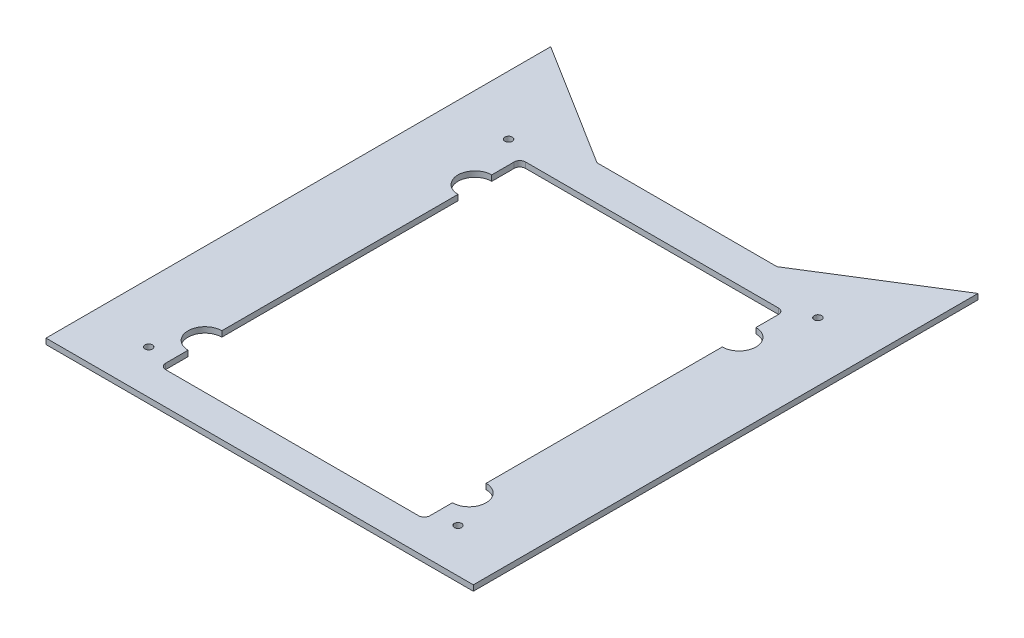
ISO-10303-21;
HEADER;
FILE_DESCRIPTION(('STEP AP214'),'2;1');
FILE_NAME('part.step','',(''),(''),'','','');
FILE_SCHEMA(('AUTOMOTIVE_DESIGN { 1 0 10303 214 1 1 1 1 }'));
ENDSEC;
DATA;
#1=APPLICATION_CONTEXT('core data for automotive mechanical design processes');
#2=APPLICATION_PROTOCOL_DEFINITION('international standard','automotive_design',2000,#1);
#3=PRODUCT_CONTEXT('',#1,'mechanical');
#4=PRODUCT('Part','Part','',(#3));
#5=PRODUCT_RELATED_PRODUCT_CATEGORY('part','',(#4));
#6=PRODUCT_DEFINITION_FORMATION('','',#4);
#7=PRODUCT_DEFINITION_CONTEXT('part definition',#1,'design');
#8=PRODUCT_DEFINITION('design','',#6,#7);
#9=PRODUCT_DEFINITION_SHAPE('','',#8);
#10=(LENGTH_UNIT() NAMED_UNIT(*) SI_UNIT(.MILLI.,.METRE.));
#11=(NAMED_UNIT(*) PLANE_ANGLE_UNIT() SI_UNIT($,.RADIAN.));
#12=(NAMED_UNIT(*) SI_UNIT($,.STERADIAN.) SOLID_ANGLE_UNIT());
#13=UNCERTAINTY_MEASURE_WITH_UNIT(LENGTH_MEASURE(1.E-05),#10,'distance_accuracy_value','');
#14=(GEOMETRIC_REPRESENTATION_CONTEXT(3) GLOBAL_UNCERTAINTY_ASSIGNED_CONTEXT((#13)) GLOBAL_UNIT_ASSIGNED_CONTEXT((#10,
#11,#12)) REPRESENTATION_CONTEXT('',''));
#15=CARTESIAN_POINT('',(0.,0.,0.));
#16=DIRECTION('',(0.,0.,1.));
#17=DIRECTION('',(1.,0.,0.));
#18=AXIS2_PLACEMENT_3D('',#15,#16,#17);
#19=CARTESIAN_POINT('',(0.,3.175,0.));
#20=DIRECTION('',(0.,1.,0.));
#21=DIRECTION('',(0.,0.,1.));
#22=AXIS2_PLACEMENT_3D('',#19,#20,#21);
#23=PLANE('',#22);
#24=DIRECTION('',(0.,0.,-1.));
#25=VECTOR('',#24,1.);
#26=CARTESIAN_POINT('',(-96.6368353735841,3.175,153.2154013619));
#27=LINE('',#26,#25);
#28=CARTESIAN_POINT('',(-96.6368353735841,3.175,438.1716513619));
#29=VERTEX_POINT('',#28);
#30=CARTESIAN_POINT('',(-96.6368353735841,3.175,153.2154013619));
#31=VERTEX_POINT('',#30);
#32=EDGE_CURVE('E66',#29,#31,#27,.T.);
#33=ORIENTED_EDGE('',*,*,#32,.F.);
#34=DIRECTION('',(1.,0.,0.));
#35=VECTOR('',#34,1.);
#36=CARTESIAN_POINT('',(-191.886835373584,3.175,438.1716513619));
#37=LINE('',#36,#35);
#38=CARTESIAN_POINT('',(144.663164626416,3.175,438.171651361899));
#39=VERTEX_POINT('',#38);
#40=EDGE_CURVE('E215',#29,#39,#37,.T.);
#41=ORIENTED_EDGE('',*,*,#40,.T.);
#42=DIRECTION('',(0.,0.,1.));
#43=VECTOR('',#42,1.);
#44=CARTESIAN_POINT('',(144.663164626416,3.175,153.2154013619));
#45=LINE('',#44,#43);
#46=CARTESIAN_POINT('',(144.663164626416,3.175,153.2154013619));
#47=VERTEX_POINT('',#46);
#48=EDGE_CURVE('E381',#47,#39,#45,.T.);
#49=ORIENTED_EDGE('',*,*,#48,.F.);
#50=DIRECTION('',(-0.847998304005083,0.,0.529998940003187));
#51=VECTOR('',#50,1.);
#52=CARTESIAN_POINT('',(176.413164626416,3.175,133.371651361899));
#53=LINE('',#52,#51);
#54=CARTESIAN_POINT('',(74.8131646264159,3.175,196.871651361901));
#55=VERTEX_POINT('',#54);
#56=EDGE_CURVE('E221',#47,#55,#53,.T.);
#57=ORIENTED_EDGE('',*,*,#56,.T.);
#58=DIRECTION('',(-1.,0.,0.));
#59=VECTOR('',#58,1.);
#60=CARTESIAN_POINT('',(74.8131646264159,3.175,196.871651361901));
#61=LINE('',#60,#59);
#62=CARTESIAN_POINT('',(-26.7868353735841,3.175,196.871651361901));
#63=VERTEX_POINT('',#62);
#64=EDGE_CURVE('E518',#55,#63,#61,.T.);
#65=ORIENTED_EDGE('',*,*,#64,.T.);
#66=DIRECTION('',(-0.847998304005083,0.,-0.529998940003187));
#67=VECTOR('',#66,1.);
#68=CARTESIAN_POINT('',(-128.386835373584,3.175,133.371651361899));
#69=LINE('',#68,#67);
#70=EDGE_CURVE('E230',#63,#31,#69,.T.);
#71=ORIENTED_EDGE('',*,*,#70,.T.);
#72=EDGE_LOOP('',(#33,#41,#49,#57,#65,#71));
#73=FACE_BOUND('',#72,.T.);
#74=CARTESIAN_POINT('',(111.32566462639,3.175,413.498576853187));
#75=DIRECTION('',(0.,1.,0.));
#76=DIRECTION('',(0.,0.,1.));
#77=AXIS2_PLACEMENT_3D('',#74,#75,#76);
#78=CIRCLE('',#77,2.08280000000002);
#79=CARTESIAN_POINT('',(111.32566462639,3.175,415.581376853187));
#80=VERTEX_POINT('',#79);
#81=EDGE_CURVE('E364',#80,#80,#78,.T.);
#82=ORIENTED_EDGE('',*,*,#81,.F.);
#83=EDGE_LOOP('',(#82));
#84=FACE_BOUND('',#83,.T.);
#85=CARTESIAN_POINT('',(-63.2993353736587,3.175,413.498576853187));
#86=DIRECTION('',(0.,1.,0.));
#87=DIRECTION('',(0.,0.,-1.));
#88=AXIS2_PLACEMENT_3D('',#85,#86,#87);
#89=CIRCLE('',#88,2.0828);
#90=CARTESIAN_POINT('',(-63.2993353736587,3.175,411.415776853187));
#91=VERTEX_POINT('',#90);
#92=EDGE_CURVE('E500',#91,#91,#89,.T.);
#93=ORIENTED_EDGE('',*,*,#92,.F.);
#94=EDGE_LOOP('',(#93));
#95=FACE_BOUND('',#94,.T.);
#96=CARTESIAN_POINT('',(-63.2993353736587,3.175,210.298576853187));
#97=DIRECTION('',(0.,1.,0.));
#98=DIRECTION('',(0.,0.,-1.));
#99=AXIS2_PLACEMENT_3D('',#96,#97,#98);
#100=CIRCLE('',#99,2.0828);
#101=CARTESIAN_POINT('',(-63.2993353736587,3.175,208.215776853187));
#102=VERTEX_POINT('',#101);
#103=EDGE_CURVE('E393',#102,#102,#100,.T.);
#104=ORIENTED_EDGE('',*,*,#103,.F.);
#105=EDGE_LOOP('',(#104));
#106=FACE_BOUND('',#105,.T.);
#107=CARTESIAN_POINT('',(98.6256646263904,3.175,394.448576853187));
#108=DIRECTION('',(0.,1.,0.));
#109=DIRECTION('',(0.,0.,1.));
#110=AXIS2_PLACEMENT_3D('',#107,#108,#109);
#111=CIRCLE('',#110,9.52500000000001);
#112=CARTESIAN_POINT('',(98.6256646263904,3.175,403.973576853187));
#113=VERTEX_POINT('',#112);
#114=CARTESIAN_POINT('',(98.6256646263904,3.175,384.923576853187));
#115=VERTEX_POINT('',#114);
#116=EDGE_CURVE('E410',#113,#115,#111,.T.);
#117=ORIENTED_EDGE('',*,*,#116,.F.);
#118=DIRECTION('',(0.,0.,-1.));
#119=VECTOR('',#118,1.);
#120=CARTESIAN_POINT('',(98.6256646263904,3.175,403.973576853187));
#121=LINE('',#120,#119);
#122=CARTESIAN_POINT('',(98.6256646263904,3.175,416.673576853187));
#123=VERTEX_POINT('',#122);
#124=EDGE_CURVE('E413',#123,#113,#121,.T.);
#125=ORIENTED_EDGE('',*,*,#124,.F.);
#126=CARTESIAN_POINT('',(95.4506646263903,3.175,416.673576853187));
#127=DIRECTION('',(0.,1.,0.));
#128=DIRECTION('',(0.,0.,1.));
#129=AXIS2_PLACEMENT_3D('',#126,#127,#128);
#130=CIRCLE('',#129,3.175);
#131=CARTESIAN_POINT('',(95.4506646263903,3.175,419.848576853187));
#132=VERTEX_POINT('',#131);
#133=EDGE_CURVE('E271',#123,#132,#130,.F.);
#134=ORIENTED_EDGE('',*,*,#133,.T.);
#135=DIRECTION('',(1.,0.,0.));
#136=VECTOR('',#135,1.);
#137=CARTESIAN_POINT('',(-50.5993353736097,3.175,419.848576853187));
#138=LINE('',#137,#136);
#139=CARTESIAN_POINT('',(-47.4243353736097,3.175,419.848576853187));
#140=VERTEX_POINT('',#139);
#141=EDGE_CURVE('E422',#140,#132,#138,.T.);
#142=ORIENTED_EDGE('',*,*,#141,.F.);
#143=CARTESIAN_POINT('',(-47.4243353736097,3.175,416.673576853187));
#144=DIRECTION('',(0.,1.,0.));
#145=DIRECTION('',(0.,0.,1.));
#146=AXIS2_PLACEMENT_3D('',#143,#144,#145);
#147=CIRCLE('',#146,3.175);
#148=CARTESIAN_POINT('',(-50.5993353736097,3.175,416.673576853187));
#149=VERTEX_POINT('',#148);
#150=EDGE_CURVE('E265',#140,#149,#147,.F.);
#151=ORIENTED_EDGE('',*,*,#150,.T.);
#152=DIRECTION('',(0.,0.,1.));
#153=VECTOR('',#152,1.);
#154=CARTESIAN_POINT('',(-50.5993353736097,3.175,403.973576853187));
#155=LINE('',#154,#153);
#156=CARTESIAN_POINT('',(-50.5993353736097,3.175,403.973576853187));
#157=VERTEX_POINT('',#156);
#158=EDGE_CURVE('E428',#157,#149,#155,.T.);
#159=ORIENTED_EDGE('',*,*,#158,.F.);
#160=CARTESIAN_POINT('',(-50.5993353736097,3.175,394.448576853187));
#161=DIRECTION('',(0.,1.,0.));
#162=DIRECTION('',(0.,0.,1.));
#163=AXIS2_PLACEMENT_3D('',#160,#161,#162);
#164=CIRCLE('',#163,9.52500000000001);
#165=CARTESIAN_POINT('',(-50.5993353736097,3.175,384.923576853187));
#166=VERTEX_POINT('',#165);
#167=EDGE_CURVE('E438',#166,#157,#164,.T.);
#168=ORIENTED_EDGE('',*,*,#167,.F.);
#169=DIRECTION('',(0.,0.,1.));
#170=VECTOR('',#169,1.);
#171=CARTESIAN_POINT('',(-50.5993353736097,3.175,251.573576853187));
#172=LINE('',#171,#170);
#173=CARTESIAN_POINT('',(-50.5993353736097,3.175,251.573576853187));
#174=VERTEX_POINT('',#173);
#175=EDGE_CURVE('E441',#174,#166,#172,.T.);
#176=ORIENTED_EDGE('',*,*,#175,.F.);
#177=CARTESIAN_POINT('',(-50.5993353736097,3.175,242.048576853187));
#178=DIRECTION('',(0.,1.,0.));
#179=DIRECTION('',(0.,0.,1.));
#180=AXIS2_PLACEMENT_3D('',#177,#178,#179);
#181=CIRCLE('',#180,9.52500000000001);
#182=CARTESIAN_POINT('',(-50.5993353736097,3.175,232.523576853187));
#183=VERTEX_POINT('',#182);
#184=EDGE_CURVE('E320',#183,#174,#181,.T.);
#185=ORIENTED_EDGE('',*,*,#184,.F.);
#186=DIRECTION('',(0.,0.,1.));
#187=VECTOR('',#186,1.);
#188=CARTESIAN_POINT('',(-50.5993353736097,3.175,216.648576853187));
#189=LINE('',#188,#187);
#190=CARTESIAN_POINT('',(-50.5993353736097,3.175,219.823576853187));
#191=VERTEX_POINT('',#190);
#192=EDGE_CURVE('E311',#191,#183,#189,.T.);
#193=ORIENTED_EDGE('',*,*,#192,.F.);
#194=CARTESIAN_POINT('',(-47.4243353736097,3.175,219.823576853187));
#195=DIRECTION('',(0.,1.,0.));
#196=DIRECTION('',(0.,0.,1.));
#197=AXIS2_PLACEMENT_3D('',#194,#195,#196);
#198=CIRCLE('',#197,3.175);
#199=CARTESIAN_POINT('',(-47.4243353736097,3.175,216.648576853187));
#200=VERTEX_POINT('',#199);
#201=EDGE_CURVE('E12',#191,#200,#198,.F.);
#202=ORIENTED_EDGE('',*,*,#201,.T.);
#203=DIRECTION('',(-1.,0.,0.));
#204=VECTOR('',#203,1.);
#205=CARTESIAN_POINT('',(-50.5993353736097,3.175,216.648576853187));
#206=LINE('',#205,#204);
#207=CARTESIAN_POINT('',(95.4506646263903,3.175,216.648576853187));
#208=VERTEX_POINT('',#207);
#209=EDGE_CURVE('E308',#208,#200,#206,.T.);
#210=ORIENTED_EDGE('',*,*,#209,.F.);
#211=CARTESIAN_POINT('',(95.4506646263903,3.175,219.823576853187));
#212=DIRECTION('',(0.,1.,0.));
#213=DIRECTION('',(0.,0.,1.));
#214=AXIS2_PLACEMENT_3D('',#211,#212,#213);
#215=CIRCLE('',#214,3.175);
#216=CARTESIAN_POINT('',(98.6256646263903,3.175,219.823576853187));
#217=VERTEX_POINT('',#216);
#218=EDGE_CURVE('E277',#208,#217,#215,.F.);
#219=ORIENTED_EDGE('',*,*,#218,.T.);
#220=DIRECTION('',(0.,0.,-1.));
#221=VECTOR('',#220,1.);
#222=CARTESIAN_POINT('',(98.6256646263903,3.175,216.648576853187));
#223=LINE('',#222,#221);
#224=CARTESIAN_POINT('',(98.6256646263903,3.175,232.523576853187));
#225=VERTEX_POINT('',#224);
#226=EDGE_CURVE('E316',#225,#217,#223,.T.);
#227=ORIENTED_EDGE('',*,*,#226,.F.);
#228=CARTESIAN_POINT('',(98.6256646263903,3.175,242.048576853187));
#229=DIRECTION('',(0.,1.,0.));
#230=DIRECTION('',(0.,0.,1.));
#231=AXIS2_PLACEMENT_3D('',#228,#229,#230);
#232=CIRCLE('',#231,9.52500000000001);
#233=CARTESIAN_POINT('',(98.6256646263903,3.175,251.573576853187));
#234=VERTEX_POINT('',#233);
#235=EDGE_CURVE('E323',#234,#225,#232,.T.);
#236=ORIENTED_EDGE('',*,*,#235,.F.);
#237=DIRECTION('',(0.,0.,-1.));
#238=VECTOR('',#237,1.);
#239=CARTESIAN_POINT('',(98.6256646263903,3.175,251.573576853187));
#240=LINE('',#239,#238);
#241=EDGE_CURVE('E342',#115,#234,#240,.T.);
#242=ORIENTED_EDGE('',*,*,#241,.F.);
#243=EDGE_LOOP('',(#117,#125,#134,#142,#151,#159,#168,#176,#185,#193,#202,#210,#219,#227,#236,#242));
#244=FACE_BOUND('',#243,.T.);
#245=CARTESIAN_POINT('',(111.32566462639,3.175,210.298576853187));
#246=DIRECTION('',(0.,1.,0.));
#247=DIRECTION('',(0.,0.,1.));
#248=AXIS2_PLACEMENT_3D('',#245,#246,#247);
#249=CIRCLE('',#248,2.0828);
#250=CARTESIAN_POINT('',(111.32566462639,3.175,212.381376853187));
#251=VERTEX_POINT('',#250);
#252=EDGE_CURVE('E352',#251,#251,#249,.T.);
#253=ORIENTED_EDGE('',*,*,#252,.F.);
#254=EDGE_LOOP('',(#253));
#255=FACE_BOUND('',#254,.T.);
#256=ADVANCED_FACE('F42',(#73,#84,#95,#106,#244,#255),#23,.T.);
#257=CARTESIAN_POINT('',(0.,0.,0.));
#258=DIRECTION('',(0.,1.,0.));
#259=DIRECTION('',(0.,0.,1.));
#260=AXIS2_PLACEMENT_3D('',#257,#258,#259);
#261=PLANE('',#260);
#262=CARTESIAN_POINT('',(111.32566462639,0.,413.498576853187));
#263=DIRECTION('',(0.,1.,0.));
#264=DIRECTION('',(0.,0.,1.));
#265=AXIS2_PLACEMENT_3D('',#262,#263,#264);
#266=CIRCLE('',#265,2.08280000000002);
#267=CARTESIAN_POINT('',(111.32566462639,0.,415.581376853187));
#268=VERTEX_POINT('',#267);
#269=EDGE_CURVE('E503',#268,#268,#266,.T.);
#270=ORIENTED_EDGE('',*,*,#269,.T.);
#271=EDGE_LOOP('',(#270));
#272=FACE_BOUND('',#271,.T.);
#273=CARTESIAN_POINT('',(-63.2993353736587,0.,413.498576853187));
#274=DIRECTION('',(0.,1.,0.));
#275=DIRECTION('',(0.,0.,-1.));
#276=AXIS2_PLACEMENT_3D('',#273,#274,#275);
#277=CIRCLE('',#276,2.0828);
#278=CARTESIAN_POINT('',(-63.2993353736587,0.,411.415776853187));
#279=VERTEX_POINT('',#278);
#280=EDGE_CURVE('E359',#279,#279,#277,.T.);
#281=ORIENTED_EDGE('',*,*,#280,.T.);
#282=EDGE_LOOP('',(#281));
#283=FACE_BOUND('',#282,.T.);
#284=CARTESIAN_POINT('',(-63.2993353736587,0.,210.298576853187));
#285=DIRECTION('',(0.,1.,0.));
#286=DIRECTION('',(0.,0.,-1.));
#287=AXIS2_PLACEMENT_3D('',#284,#285,#286);
#288=CIRCLE('',#287,2.0828);
#289=CARTESIAN_POINT('',(-63.2993353736587,0.,208.215776853187));
#290=VERTEX_POINT('',#289);
#291=EDGE_CURVE('E398',#290,#290,#288,.T.);
#292=ORIENTED_EDGE('',*,*,#291,.T.);
#293=EDGE_LOOP('',(#292));
#294=FACE_BOUND('',#293,.T.);
#295=DIRECTION('',(1.,0.,0.));
#296=VECTOR('',#295,1.);
#297=CARTESIAN_POINT('',(-50.5993353736097,0.,419.848576853187));
#298=LINE('',#297,#296);
#299=CARTESIAN_POINT('',(-47.4243353736097,0.,419.848576853187));
#300=VERTEX_POINT('',#299);
#301=CARTESIAN_POINT('',(95.4506646263903,0.,419.848576853187));
#302=VERTEX_POINT('',#301);
#303=EDGE_CURVE('E531',#300,#302,#298,.T.);
#304=ORIENTED_EDGE('',*,*,#303,.T.);
#305=CARTESIAN_POINT('',(95.4506646263903,0.,416.673576853187));
#306=DIRECTION('',(0.,1.,0.));
#307=DIRECTION('',(0.,0.,1.));
#308=AXIS2_PLACEMENT_3D('',#305,#306,#307);
#309=CIRCLE('',#308,3.175);
#310=CARTESIAN_POINT('',(98.6256646263904,0.,416.673576853187));
#311=VERTEX_POINT('',#310);
#312=EDGE_CURVE('E268',#302,#311,#309,.T.);
#313=ORIENTED_EDGE('',*,*,#312,.T.);
#314=DIRECTION('',(0.,0.,-1.));
#315=VECTOR('',#314,1.);
#316=CARTESIAN_POINT('',(98.6256646263904,0.,403.973576853187));
#317=LINE('',#316,#315);
#318=CARTESIAN_POINT('',(98.6256646263904,0.,403.973576853187));
#319=VERTEX_POINT('',#318);
#320=EDGE_CURVE('E431',#311,#319,#317,.T.);
#321=ORIENTED_EDGE('',*,*,#320,.T.);
#322=CARTESIAN_POINT('',(98.6256646263904,0.,394.448576853187));
#323=DIRECTION('',(0.,1.,0.));
#324=DIRECTION('',(0.,0.,1.));
#325=AXIS2_PLACEMENT_3D('',#322,#323,#324);
#326=CIRCLE('',#325,9.52500000000001);
#327=CARTESIAN_POINT('',(98.6256646263904,0.,384.923576853187));
#328=VERTEX_POINT('',#327);
#329=EDGE_CURVE('E558',#319,#328,#326,.T.);
#330=ORIENTED_EDGE('',*,*,#329,.T.);
#331=DIRECTION('',(0.,0.,-1.));
#332=VECTOR('',#331,1.);
#333=CARTESIAN_POINT('',(98.6256646263903,0.,251.573576853187));
#334=LINE('',#333,#332);
#335=CARTESIAN_POINT('',(98.6256646263903,0.,251.573576853187));
#336=VERTEX_POINT('',#335);
#337=EDGE_CURVE('E555',#328,#336,#334,.T.);
#338=ORIENTED_EDGE('',*,*,#337,.T.);
#339=CARTESIAN_POINT('',(98.6256646263903,0.,242.048576853187));
#340=DIRECTION('',(0.,1.,0.));
#341=DIRECTION('',(0.,0.,1.));
#342=AXIS2_PLACEMENT_3D('',#339,#340,#341);
#343=CIRCLE('',#342,9.52500000000001);
#344=CARTESIAN_POINT('',(98.6256646263903,0.,232.523576853187));
#345=VERTEX_POINT('',#344);
#346=EDGE_CURVE('E551',#336,#345,#343,.T.);
#347=ORIENTED_EDGE('',*,*,#346,.T.);
#348=DIRECTION('',(0.,0.,-1.));
#349=VECTOR('',#348,1.);
#350=CARTESIAN_POINT('',(98.6256646263903,0.,216.648576853187));
#351=LINE('',#350,#349);
#352=CARTESIAN_POINT('',(98.6256646263903,0.,219.823576853187));
#353=VERTEX_POINT('',#352);
#354=EDGE_CURVE('E547',#345,#353,#351,.T.);
#355=ORIENTED_EDGE('',*,*,#354,.T.);
#356=CARTESIAN_POINT('',(95.4506646263903,0.,219.823576853187));
#357=DIRECTION('',(0.,1.,0.));
#358=DIRECTION('',(0.,0.,1.));
#359=AXIS2_PLACEMENT_3D('',#356,#357,#358);
#360=CIRCLE('',#359,3.175);
#361=CARTESIAN_POINT('',(95.4506646263903,0.,216.648576853187));
#362=VERTEX_POINT('',#361);
#363=EDGE_CURVE('E274',#353,#362,#360,.T.);
#364=ORIENTED_EDGE('',*,*,#363,.T.);
#365=DIRECTION('',(-1.,0.,0.));
#366=VECTOR('',#365,1.);
#367=CARTESIAN_POINT('',(-50.5993353736097,0.,216.648576853187));
#368=LINE('',#367,#366);
#369=CARTESIAN_POINT('',(-47.4243353736097,0.,216.648576853187));
#370=VERTEX_POINT('',#369);
#371=EDGE_CURVE('E289',#362,#370,#368,.T.);
#372=ORIENTED_EDGE('',*,*,#371,.T.);
#373=CARTESIAN_POINT('',(-47.4243353736097,0.,219.823576853187));
#374=DIRECTION('',(0.,1.,0.));
#375=DIRECTION('',(0.,0.,1.));
#376=AXIS2_PLACEMENT_3D('',#373,#374,#375);
#377=CIRCLE('',#376,3.175);
#378=CARTESIAN_POINT('',(-50.5993353736097,0.,219.823576853187));
#379=VERTEX_POINT('',#378);
#380=EDGE_CURVE('E51',#370,#379,#377,.T.);
#381=ORIENTED_EDGE('',*,*,#380,.T.);
#382=DIRECTION('',(0.,0.,1.));
#383=VECTOR('',#382,1.);
#384=CARTESIAN_POINT('',(-50.5993353736097,0.,216.648576853187));
#385=LINE('',#384,#383);
#386=CARTESIAN_POINT('',(-50.5993353736097,0.,232.523576853187));
#387=VERTEX_POINT('',#386);
#388=EDGE_CURVE('E286',#379,#387,#385,.T.);
#389=ORIENTED_EDGE('',*,*,#388,.T.);
#390=CARTESIAN_POINT('',(-50.5993353736097,0.,242.048576853187));
#391=DIRECTION('',(0.,1.,0.));
#392=DIRECTION('',(0.,0.,1.));
#393=AXIS2_PLACEMENT_3D('',#390,#391,#392);
#394=CIRCLE('',#393,9.52500000000001);
#395=CARTESIAN_POINT('',(-50.5993353736097,0.,251.573576853187));
#396=VERTEX_POINT('',#395);
#397=EDGE_CURVE('E300',#387,#396,#394,.T.);
#398=ORIENTED_EDGE('',*,*,#397,.T.);
#399=DIRECTION('',(0.,0.,1.));
#400=VECTOR('',#399,1.);
#401=CARTESIAN_POINT('',(-50.5993353736097,0.,251.573576853187));
#402=LINE('',#401,#400);
#403=CARTESIAN_POINT('',(-50.5993353736097,0.,384.923576853187));
#404=VERTEX_POINT('',#403);
#405=EDGE_CURVE('E540',#396,#404,#402,.T.);
#406=ORIENTED_EDGE('',*,*,#405,.T.);
#407=CARTESIAN_POINT('',(-50.5993353736097,0.,394.448576853187));
#408=DIRECTION('',(0.,1.,0.));
#409=DIRECTION('',(0.,0.,1.));
#410=AXIS2_PLACEMENT_3D('',#407,#408,#409);
#411=CIRCLE('',#410,9.52500000000001);
#412=CARTESIAN_POINT('',(-50.5993353736097,0.,403.973576853187));
#413=VERTEX_POINT('',#412);
#414=EDGE_CURVE('E465',#404,#413,#411,.T.);
#415=ORIENTED_EDGE('',*,*,#414,.T.);
#416=DIRECTION('',(0.,0.,1.));
#417=VECTOR('',#416,1.);
#418=CARTESIAN_POINT('',(-50.5993353736097,0.,403.973576853187));
#419=LINE('',#418,#417);
#420=CARTESIAN_POINT('',(-50.5993353736097,0.,416.673576853187));
#421=VERTEX_POINT('',#420);
#422=EDGE_CURVE('E534',#413,#421,#419,.T.);
#423=ORIENTED_EDGE('',*,*,#422,.T.);
#424=CARTESIAN_POINT('',(-47.4243353736097,0.,416.673576853187));
#425=DIRECTION('',(0.,1.,0.));
#426=DIRECTION('',(0.,0.,1.));
#427=AXIS2_PLACEMENT_3D('',#424,#425,#426);
#428=CIRCLE('',#427,3.175);
#429=EDGE_CURVE('E262',#421,#300,#428,.T.);
#430=ORIENTED_EDGE('',*,*,#429,.T.);
#431=EDGE_LOOP('',(#304,#313,#321,#330,#338,#347,#355,#364,#372,#381,#389,#398,#406,#415,#423,#430));
#432=FACE_BOUND('',#431,.T.);
#433=CARTESIAN_POINT('',(111.32566462639,0.,210.298576853187));
#434=DIRECTION('',(0.,1.,0.));
#435=DIRECTION('',(0.,0.,1.));
#436=AXIS2_PLACEMENT_3D('',#433,#434,#435);
#437=CIRCLE('',#436,2.0828);
#438=CARTESIAN_POINT('',(111.32566462639,0.,212.381376853187));
#439=VERTEX_POINT('',#438);
#440=EDGE_CURVE('E358',#439,#439,#437,.T.);
#441=ORIENTED_EDGE('',*,*,#440,.T.);
#442=EDGE_LOOP('',(#441));
#443=FACE_BOUND('',#442,.T.);
#444=DIRECTION('',(1.,0.,0.));
#445=VECTOR('',#444,1.);
#446=CARTESIAN_POINT('',(-191.886835373584,0.,438.1716513619));
#447=LINE('',#446,#445);
#448=CARTESIAN_POINT('',(-96.6368353735841,0.,438.1716513619));
#449=VERTEX_POINT('',#448);
#450=CARTESIAN_POINT('',(144.663164626416,0.,438.171651361899));
#451=VERTEX_POINT('',#450);
#452=EDGE_CURVE('E207',#449,#451,#447,.T.);
#453=ORIENTED_EDGE('',*,*,#452,.F.);
#454=DIRECTION('',(0.,0.,-1.));
#455=VECTOR('',#454,1.);
#456=CARTESIAN_POINT('',(-96.6368353735841,0.,153.2154013619));
#457=LINE('',#456,#455);
#458=CARTESIAN_POINT('',(-96.6368353735841,0.,153.2154013619));
#459=VERTEX_POINT('',#458);
#460=EDGE_CURVE('E191',#449,#459,#457,.T.);
#461=ORIENTED_EDGE('',*,*,#460,.T.);
#462=DIRECTION('',(-0.847998304005083,0.,-0.529998940003187));
#463=VECTOR('',#462,1.);
#464=CARTESIAN_POINT('',(-128.386835373584,0.,133.371651361899));
#465=LINE('',#464,#463);
#466=CARTESIAN_POINT('',(-26.7868353735841,0.,196.871651361901));
#467=VERTEX_POINT('',#466);
#468=EDGE_CURVE('E205',#467,#459,#465,.T.);
#469=ORIENTED_EDGE('',*,*,#468,.F.);
#470=DIRECTION('',(-1.,0.,0.));
#471=VECTOR('',#470,1.);
#472=CARTESIAN_POINT('',(74.8131646264159,0.,196.871651361901));
#473=LINE('',#472,#471);
#474=CARTESIAN_POINT('',(74.8131646264159,0.,196.871651361901));
#475=VERTEX_POINT('',#474);
#476=EDGE_CURVE('E216',#475,#467,#473,.T.);
#477=ORIENTED_EDGE('',*,*,#476,.F.);
#478=DIRECTION('',(-0.847998304005083,0.,0.529998940003187));
#479=VECTOR('',#478,1.);
#480=CARTESIAN_POINT('',(176.413164626416,0.,133.371651361899));
#481=LINE('',#480,#479);
#482=CARTESIAN_POINT('',(144.663164626416,0.,153.2154013619));
#483=VERTEX_POINT('',#482);
#484=EDGE_CURVE('E223',#483,#475,#481,.T.);
#485=ORIENTED_EDGE('',*,*,#484,.F.);
#486=DIRECTION('',(0.,0.,1.));
#487=VECTOR('',#486,1.);
#488=CARTESIAN_POINT('',(144.663164626416,0.,153.2154013619));
#489=LINE('',#488,#487);
#490=EDGE_CURVE('E58',#483,#451,#489,.T.);
#491=ORIENTED_EDGE('',*,*,#490,.T.);
#492=EDGE_LOOP('',(#453,#461,#469,#477,#485,#491));
#493=FACE_BOUND('',#492,.T.);
#494=ADVANCED_FACE('F203',(#272,#283,#294,#432,#443,#493),#261,.F.);
#495=CARTESIAN_POINT('',(-191.886835373584,3.175,438.1716513619));
#496=DIRECTION('',(0.,0.,-1.));
#497=DIRECTION('',(-1.,0.,0.));
#498=AXIS2_PLACEMENT_3D('',#495,#496,#497);
#499=PLANE('',#498);
#500=ORIENTED_EDGE('',*,*,#40,.F.);
#501=DIRECTION('',(0.,1.,0.));
#502=VECTOR('',#501,1.);
#503=CARTESIAN_POINT('',(-96.6368353735841,0.,438.1716513619));
#504=LINE('',#503,#502);
#505=EDGE_CURVE('E198',#449,#29,#504,.T.);
#506=ORIENTED_EDGE('',*,*,#505,.F.);
#507=ORIENTED_EDGE('',*,*,#452,.T.);
#508=DIRECTION('',(0.,1.,0.));
#509=VECTOR('',#508,1.);
#510=CARTESIAN_POINT('',(144.663164626416,0.,438.171651361899));
#511=LINE('',#510,#509);
#512=EDGE_CURVE('E386',#451,#39,#511,.T.);
#513=ORIENTED_EDGE('',*,*,#512,.T.);
#514=EDGE_LOOP('',(#500,#506,#507,#513));
#515=FACE_BOUND('',#514,.T.);
#516=ADVANCED_FACE('F571',(#515),#499,.F.);
#517=CARTESIAN_POINT('',(176.413164626416,3.175,133.371651361899));
#518=DIRECTION('',(0.529998940003187,0.,0.847998304005083));
#519=DIRECTION('',(0.847998304005084,0.,-0.529998940003187));
#520=AXIS2_PLACEMENT_3D('',#517,#518,#519);
#521=PLANE('',#520);
#522=ORIENTED_EDGE('',*,*,#56,.F.);
#523=DIRECTION('',(0.,1.,0.));
#524=VECTOR('',#523,1.);
#525=CARTESIAN_POINT('',(144.663164626416,0.,153.2154013619));
#526=LINE('',#525,#524);
#527=EDGE_CURVE('E390',#483,#47,#526,.T.);
#528=ORIENTED_EDGE('',*,*,#527,.F.);
#529=ORIENTED_EDGE('',*,*,#484,.T.);
#530=DIRECTION('',(0.,-1.,0.));
#531=VECTOR('',#530,1.);
#532=CARTESIAN_POINT('',(74.8131646264159,3.175,196.871651361901));
#533=LINE('',#532,#531);
#534=EDGE_CURVE('E229',#55,#475,#533,.T.);
#535=ORIENTED_EDGE('',*,*,#534,.F.);
#536=EDGE_LOOP('',(#522,#528,#529,#535));
#537=FACE_BOUND('',#536,.T.);
#538=ADVANCED_FACE('F580',(#537),#521,.F.);
#539=CARTESIAN_POINT('',(74.8131646264159,3.175,196.871651361901));
#540=DIRECTION('',(0.,0.,1.));
#541=DIRECTION('',(1.,0.,0.));
#542=AXIS2_PLACEMENT_3D('',#539,#540,#541);
#543=PLANE('',#542);
#544=ORIENTED_EDGE('',*,*,#476,.T.);
#545=DIRECTION('',(0.,-1.,0.));
#546=VECTOR('',#545,1.);
#547=CARTESIAN_POINT('',(-26.7868353735841,3.175,196.871651361901));
#548=LINE('',#547,#546);
#549=EDGE_CURVE('E213',#63,#467,#548,.T.);
#550=ORIENTED_EDGE('',*,*,#549,.F.);
#551=ORIENTED_EDGE('',*,*,#64,.F.);
#552=ORIENTED_EDGE('',*,*,#534,.T.);
#553=EDGE_LOOP('',(#544,#550,#551,#552));
#554=FACE_BOUND('',#553,.T.);
#555=ADVANCED_FACE('F579',(#554),#543,.F.);
#556=CARTESIAN_POINT('',(-128.386835373584,3.175,133.371651361899));
#557=DIRECTION('',(-0.529998940003187,0.,0.847998304005083));
#558=DIRECTION('',(0.847998304005083,0.,0.529998940003187));
#559=AXIS2_PLACEMENT_3D('',#556,#557,#558);
#560=PLANE('',#559);
#561=ORIENTED_EDGE('',*,*,#468,.T.);
#562=DIRECTION('',(0.,1.,0.));
#563=VECTOR('',#562,1.);
#564=CARTESIAN_POINT('',(-96.6368353735841,0.,153.2154013619));
#565=LINE('',#564,#563);
#566=EDGE_CURVE('E188',#459,#31,#565,.T.);
#567=ORIENTED_EDGE('',*,*,#566,.T.);
#568=ORIENTED_EDGE('',*,*,#70,.F.);
#569=ORIENTED_EDGE('',*,*,#549,.T.);
#570=EDGE_LOOP('',(#561,#567,#568,#569));
#571=FACE_BOUND('',#570,.T.);
#572=ADVANCED_FACE('F211',(#571),#560,.F.);
#573=CARTESIAN_POINT('',(111.32566462639,3.175,210.298576853187));
#574=DIRECTION('',(0.,-1.,0.));
#575=DIRECTION('',(0.,0.,-1.));
#576=AXIS2_PLACEMENT_3D('',#573,#574,#575);
#577=CYLINDRICAL_SURFACE('',#576,2.0828);
#578=ORIENTED_EDGE('',*,*,#252,.T.);
#579=EDGE_LOOP('',(#578));
#580=FACE_BOUND('',#579,.T.);
#581=ORIENTED_EDGE('',*,*,#440,.F.);
#582=EDGE_LOOP('',(#581));
#583=FACE_BOUND('',#582,.T.);
#584=ADVANCED_FACE('F599',(#580,#583),#577,.F.);
#585=CARTESIAN_POINT('',(98.6256646263904,3.175,403.973576853187));
#586=DIRECTION('',(-1.,0.,0.));
#587=DIRECTION('',(0.,0.,1.));
#588=AXIS2_PLACEMENT_3D('',#585,#586,#587);
#589=PLANE('',#588);
#590=ORIENTED_EDGE('',*,*,#320,.F.);
#591=DIRECTION('',(0.,-1.,0.));
#592=VECTOR('',#591,1.);
#593=CARTESIAN_POINT('',(98.6256646263904,3.175,416.673576853187));
#594=LINE('',#593,#592);
#595=EDGE_CURVE('E245',#311,#123,#594,.F.);
#596=ORIENTED_EDGE('',*,*,#595,.T.);
#597=ORIENTED_EDGE('',*,*,#124,.T.);
#598=DIRECTION('',(0.,-1.,0.));
#599=VECTOR('',#598,1.);
#600=CARTESIAN_POINT('',(98.6256646263904,3.175,403.973576853187));
#601=LINE('',#600,#599);
#602=EDGE_CURVE('E491',#113,#319,#601,.T.);
#603=ORIENTED_EDGE('',*,*,#602,.T.);
#604=EDGE_LOOP('',(#590,#596,#597,#603));
#605=FACE_BOUND('',#604,.T.);
#606=ADVANCED_FACE('F643',(#605),#589,.T.);
#607=CARTESIAN_POINT('',(98.6256646263904,3.175,394.448576853187));
#608=DIRECTION('',(0.,-1.,0.));
#609=DIRECTION('',(0.,0.,-1.));
#610=AXIS2_PLACEMENT_3D('',#607,#608,#609);
#611=CYLINDRICAL_SURFACE('',#610,9.52500000000001);
#612=ORIENTED_EDGE('',*,*,#329,.F.);
#613=ORIENTED_EDGE('',*,*,#602,.F.);
#614=ORIENTED_EDGE('',*,*,#116,.T.);
#615=DIRECTION('',(0.,-1.,0.));
#616=VECTOR('',#615,1.);
#617=CARTESIAN_POINT('',(98.6256646263904,3.175,384.923576853187));
#618=LINE('',#617,#616);
#619=EDGE_CURVE('E488',#115,#328,#618,.T.);
#620=ORIENTED_EDGE('',*,*,#619,.T.);
#621=EDGE_LOOP('',(#612,#613,#614,#620));
#622=FACE_BOUND('',#621,.T.);
#623=ADVANCED_FACE('F647',(#622),#611,.F.);
#624=CARTESIAN_POINT('',(98.6256646263903,3.175,251.573576853187));
#625=DIRECTION('',(-1.,0.,0.));
#626=DIRECTION('',(0.,0.,1.));
#627=AXIS2_PLACEMENT_3D('',#624,#625,#626);
#628=PLANE('',#627);
#629=ORIENTED_EDGE('',*,*,#337,.F.);
#630=ORIENTED_EDGE('',*,*,#619,.F.);
#631=ORIENTED_EDGE('',*,*,#241,.T.);
#632=DIRECTION('',(0.,-1.,0.));
#633=VECTOR('',#632,1.);
#634=CARTESIAN_POINT('',(98.6256646263903,3.175,251.573576853187));
#635=LINE('',#634,#633);
#636=EDGE_CURVE('E485',#234,#336,#635,.T.);
#637=ORIENTED_EDGE('',*,*,#636,.T.);
#638=EDGE_LOOP('',(#629,#630,#631,#637));
#639=FACE_BOUND('',#638,.T.);
#640=ADVANCED_FACE('F649',(#639),#628,.T.);
#641=CARTESIAN_POINT('',(98.6256646263903,3.175,242.048576853187));
#642=DIRECTION('',(0.,-1.,0.));
#643=DIRECTION('',(0.,0.,-1.));
#644=AXIS2_PLACEMENT_3D('',#641,#642,#643);
#645=CYLINDRICAL_SURFACE('',#644,9.52500000000001);
#646=ORIENTED_EDGE('',*,*,#346,.F.);
#647=ORIENTED_EDGE('',*,*,#636,.F.);
#648=ORIENTED_EDGE('',*,*,#235,.T.);
#649=DIRECTION('',(0.,-1.,0.));
#650=VECTOR('',#649,1.);
#651=CARTESIAN_POINT('',(98.6256646263903,3.175,232.523576853187));
#652=LINE('',#651,#650);
#653=EDGE_CURVE('E482',#225,#345,#652,.T.);
#654=ORIENTED_EDGE('',*,*,#653,.T.);
#655=EDGE_LOOP('',(#646,#647,#648,#654));
#656=FACE_BOUND('',#655,.T.);
#657=ADVANCED_FACE('F633',(#656),#645,.F.);
#658=CARTESIAN_POINT('',(98.6256646263903,3.175,216.648576853187));
#659=DIRECTION('',(-1.,0.,0.));
#660=DIRECTION('',(0.,0.,1.));
#661=AXIS2_PLACEMENT_3D('',#658,#659,#660);
#662=PLANE('',#661);
#663=ORIENTED_EDGE('',*,*,#226,.T.);
#664=DIRECTION('',(0.,-1.,0.));
#665=VECTOR('',#664,1.);
#666=CARTESIAN_POINT('',(98.6256646263903,0.,219.823576853187));
#667=LINE('',#666,#665);
#668=EDGE_CURVE('E248',#217,#353,#667,.T.);
#669=ORIENTED_EDGE('',*,*,#668,.T.);
#670=ORIENTED_EDGE('',*,*,#354,.F.);
#671=ORIENTED_EDGE('',*,*,#653,.F.);
#672=EDGE_LOOP('',(#663,#669,#670,#671));
#673=FACE_BOUND('',#672,.T.);
#674=ADVANCED_FACE('F629',(#673),#662,.T.);
#675=CARTESIAN_POINT('',(-50.5993353736097,3.175,216.648576853187));
#676=DIRECTION('',(0.,0.,1.));
#677=DIRECTION('',(1.,0.,0.));
#678=AXIS2_PLACEMENT_3D('',#675,#676,#677);
#679=PLANE('',#678);
#680=ORIENTED_EDGE('',*,*,#371,.F.);
#681=DIRECTION('',(0.,-1.,0.));
#682=VECTOR('',#681,1.);
#683=CARTESIAN_POINT('',(95.4506646263903,3.175,216.648576853187));
#684=LINE('',#683,#682);
#685=EDGE_CURVE('E256',#362,#208,#684,.F.);
#686=ORIENTED_EDGE('',*,*,#685,.T.);
#687=ORIENTED_EDGE('',*,*,#209,.T.);
#688=DIRECTION('',(0.,-1.,0.));
#689=VECTOR('',#688,1.);
#690=CARTESIAN_POINT('',(-47.4243353736097,0.,216.648576853187));
#691=LINE('',#690,#689);
#692=EDGE_CURVE('E252',#200,#370,#691,.T.);
#693=ORIENTED_EDGE('',*,*,#692,.T.);
#694=EDGE_LOOP('',(#680,#686,#687,#693));
#695=FACE_BOUND('',#694,.T.);
#696=ADVANCED_FACE('F313',(#695),#679,.T.);
#697=CARTESIAN_POINT('',(-50.5993353736097,3.175,216.648576853187));
#698=DIRECTION('',(1.,0.,0.));
#699=DIRECTION('',(0.,0.,-1.));
#700=AXIS2_PLACEMENT_3D('',#697,#698,#699);
#701=PLANE('',#700);
#702=ORIENTED_EDGE('',*,*,#388,.F.);
#703=DIRECTION('',(0.,-1.,0.));
#704=VECTOR('',#703,1.);
#705=CARTESIAN_POINT('',(-50.5993353736097,3.175,219.823576853187));
#706=LINE('',#705,#704);
#707=EDGE_CURVE('E259',#379,#191,#706,.F.);
#708=ORIENTED_EDGE('',*,*,#707,.T.);
#709=ORIENTED_EDGE('',*,*,#192,.T.);
#710=DIRECTION('',(0.,-1.,0.));
#711=VECTOR('',#710,1.);
#712=CARTESIAN_POINT('',(-50.5993353736097,3.175,232.523576853187));
#713=LINE('',#712,#711);
#714=EDGE_CURVE('E297',#183,#387,#713,.T.);
#715=ORIENTED_EDGE('',*,*,#714,.T.);
#716=EDGE_LOOP('',(#702,#708,#709,#715));
#717=FACE_BOUND('',#716,.T.);
#718=ADVANCED_FACE('F294',(#717),#701,.T.);
#719=CARTESIAN_POINT('',(-50.5993353736097,3.175,242.048576853187));
#720=DIRECTION('',(0.,-1.,0.));
#721=DIRECTION('',(0.,0.,-1.));
#722=AXIS2_PLACEMENT_3D('',#719,#720,#721);
#723=CYLINDRICAL_SURFACE('',#722,9.52500000000001);
#724=ORIENTED_EDGE('',*,*,#397,.F.);
#725=ORIENTED_EDGE('',*,*,#714,.F.);
#726=ORIENTED_EDGE('',*,*,#184,.T.);
#727=DIRECTION('',(0.,-1.,0.));
#728=VECTOR('',#727,1.);
#729=CARTESIAN_POINT('',(-50.5993353736097,3.175,251.573576853187));
#730=LINE('',#729,#728);
#731=EDGE_CURVE('E459',#174,#396,#730,.T.);
#732=ORIENTED_EDGE('',*,*,#731,.T.);
#733=EDGE_LOOP('',(#724,#725,#726,#732));
#734=FACE_BOUND('',#733,.T.);
#735=ADVANCED_FACE('F696',(#734),#723,.F.);
#736=CARTESIAN_POINT('',(-50.5993353736097,3.175,251.573576853187));
#737=DIRECTION('',(1.,0.,0.));
#738=DIRECTION('',(0.,0.,-1.));
#739=AXIS2_PLACEMENT_3D('',#736,#737,#738);
#740=PLANE('',#739);
#741=ORIENTED_EDGE('',*,*,#405,.F.);
#742=ORIENTED_EDGE('',*,*,#731,.F.);
#743=ORIENTED_EDGE('',*,*,#175,.T.);
#744=DIRECTION('',(0.,-1.,0.));
#745=VECTOR('',#744,1.);
#746=CARTESIAN_POINT('',(-50.5993353736097,3.175,384.923576853187));
#747=LINE('',#746,#745);
#748=EDGE_CURVE('E457',#166,#404,#747,.T.);
#749=ORIENTED_EDGE('',*,*,#748,.T.);
#750=EDGE_LOOP('',(#741,#742,#743,#749));
#751=FACE_BOUND('',#750,.T.);
#752=ADVANCED_FACE('F456',(#751),#740,.T.);
#753=CARTESIAN_POINT('',(-50.5993353736097,3.175,394.448576853187));
#754=DIRECTION('',(0.,-1.,0.));
#755=DIRECTION('',(0.,0.,-1.));
#756=AXIS2_PLACEMENT_3D('',#753,#754,#755);
#757=CYLINDRICAL_SURFACE('',#756,9.52500000000001);
#758=ORIENTED_EDGE('',*,*,#414,.F.);
#759=ORIENTED_EDGE('',*,*,#748,.F.);
#760=ORIENTED_EDGE('',*,*,#167,.T.);
#761=DIRECTION('',(0.,-1.,0.));
#762=VECTOR('',#761,1.);
#763=CARTESIAN_POINT('',(-50.5993353736097,3.175,403.973576853187));
#764=LINE('',#763,#762);
#765=EDGE_CURVE('E427',#157,#413,#764,.T.);
#766=ORIENTED_EDGE('',*,*,#765,.T.);
#767=EDGE_LOOP('',(#758,#759,#760,#766));
#768=FACE_BOUND('',#767,.T.);
#769=ADVANCED_FACE('F462',(#768),#757,.F.);
#770=CARTESIAN_POINT('',(-50.5993353736097,3.175,403.973576853187));
#771=DIRECTION('',(1.,0.,0.));
#772=DIRECTION('',(0.,0.,-1.));
#773=AXIS2_PLACEMENT_3D('',#770,#771,#772);
#774=PLANE('',#773);
#775=ORIENTED_EDGE('',*,*,#158,.T.);
#776=DIRECTION('',(0.,-1.,0.));
#777=VECTOR('',#776,1.);
#778=CARTESIAN_POINT('',(-50.5993353736097,0.,416.673576853187));
#779=LINE('',#778,#777);
#780=EDGE_CURVE('E234',#149,#421,#779,.T.);
#781=ORIENTED_EDGE('',*,*,#780,.T.);
#782=ORIENTED_EDGE('',*,*,#422,.F.);
#783=ORIENTED_EDGE('',*,*,#765,.F.);
#784=EDGE_LOOP('',(#775,#781,#782,#783));
#785=FACE_BOUND('',#784,.T.);
#786=ADVANCED_FACE('F686',(#785),#774,.T.);
#787=CARTESIAN_POINT('',(-50.5993353736097,3.175,419.848576853187));
#788=DIRECTION('',(0.,0.,-1.));
#789=DIRECTION('',(-1.,0.,0.));
#790=AXIS2_PLACEMENT_3D('',#787,#788,#789);
#791=PLANE('',#790);
#792=ORIENTED_EDGE('',*,*,#303,.F.);
#793=DIRECTION('',(0.,-1.,0.));
#794=VECTOR('',#793,1.);
#795=CARTESIAN_POINT('',(-47.4243353736097,3.175,419.848576853187));
#796=LINE('',#795,#794);
#797=EDGE_CURVE('E242',#300,#140,#796,.F.);
#798=ORIENTED_EDGE('',*,*,#797,.T.);
#799=ORIENTED_EDGE('',*,*,#141,.T.);
#800=DIRECTION('',(0.,-1.,0.));
#801=VECTOR('',#800,1.);
#802=CARTESIAN_POINT('',(95.4506646263903,0.,419.848576853187));
#803=LINE('',#802,#801);
#804=EDGE_CURVE('E238',#132,#302,#803,.T.);
#805=ORIENTED_EDGE('',*,*,#804,.T.);
#806=EDGE_LOOP('',(#792,#798,#799,#805));
#807=FACE_BOUND('',#806,.T.);
#808=ADVANCED_FACE('F671',(#807),#791,.T.);
#809=CARTESIAN_POINT('',(-63.2993353736587,3.175,210.298576853187));
#810=DIRECTION('',(0.,-1.,0.));
#811=DIRECTION('',(0.,0.,-1.));
#812=AXIS2_PLACEMENT_3D('',#809,#810,#811);
#813=CYLINDRICAL_SURFACE('',#812,2.0828);
#814=ORIENTED_EDGE('',*,*,#103,.T.);
#815=EDGE_LOOP('',(#814));
#816=FACE_BOUND('',#815,.T.);
#817=ORIENTED_EDGE('',*,*,#291,.F.);
#818=EDGE_LOOP('',(#817));
#819=FACE_BOUND('',#818,.T.);
#820=ADVANCED_FACE('F666',(#816,#819),#813,.F.);
#821=CARTESIAN_POINT('',(-63.2993353736587,3.175,413.498576853187));
#822=DIRECTION('',(0.,-1.,0.));
#823=DIRECTION('',(0.,0.,-1.));
#824=AXIS2_PLACEMENT_3D('',#821,#822,#823);
#825=CYLINDRICAL_SURFACE('',#824,2.0828);
#826=ORIENTED_EDGE('',*,*,#92,.T.);
#827=EDGE_LOOP('',(#826));
#828=FACE_BOUND('',#827,.T.);
#829=ORIENTED_EDGE('',*,*,#280,.F.);
#830=EDGE_LOOP('',(#829));
#831=FACE_BOUND('',#830,.T.);
#832=ADVANCED_FACE('F663',(#828,#831),#825,.F.);
#833=CARTESIAN_POINT('',(111.32566462639,3.175,413.498576853187));
#834=DIRECTION('',(0.,-1.,0.));
#835=DIRECTION('',(0.,0.,-1.));
#836=AXIS2_PLACEMENT_3D('',#833,#834,#835);
#837=CYLINDRICAL_SURFACE('',#836,2.08280000000002);
#838=ORIENTED_EDGE('',*,*,#81,.T.);
#839=EDGE_LOOP('',(#838));
#840=FACE_BOUND('',#839,.T.);
#841=ORIENTED_EDGE('',*,*,#269,.F.);
#842=EDGE_LOOP('',(#841));
#843=FACE_BOUND('',#842,.T.);
#844=ADVANCED_FACE('F614',(#840,#843),#837,.F.);
#845=CARTESIAN_POINT('',(-47.4243353736097,3.175,416.673576853187));
#846=DIRECTION('',(0.,1.,0.));
#847=DIRECTION('',(0.,0.,1.));
#848=AXIS2_PLACEMENT_3D('',#845,#846,#847);
#849=CYLINDRICAL_SURFACE('',#848,3.175);
#850=ORIENTED_EDGE('',*,*,#150,.F.);
#851=ORIENTED_EDGE('',*,*,#797,.F.);
#852=ORIENTED_EDGE('',*,*,#429,.F.);
#853=ORIENTED_EDGE('',*,*,#780,.F.);
#854=EDGE_LOOP('',(#850,#851,#852,#853));
#855=FACE_BOUND('',#854,.T.);
#856=ADVANCED_FACE('F610',(#855),#849,.F.);
#857=CARTESIAN_POINT('',(95.4506646263903,3.175,416.673576853187));
#858=DIRECTION('',(0.,1.,0.));
#859=DIRECTION('',(0.,0.,1.));
#860=AXIS2_PLACEMENT_3D('',#857,#858,#859);
#861=CYLINDRICAL_SURFACE('',#860,3.175);
#862=ORIENTED_EDGE('',*,*,#133,.F.);
#863=ORIENTED_EDGE('',*,*,#595,.F.);
#864=ORIENTED_EDGE('',*,*,#312,.F.);
#865=ORIENTED_EDGE('',*,*,#804,.F.);
#866=EDGE_LOOP('',(#862,#863,#864,#865));
#867=FACE_BOUND('',#866,.T.);
#868=ADVANCED_FACE('F613',(#867),#861,.F.);
#869=CARTESIAN_POINT('',(95.4506646263903,3.175,219.823576853187));
#870=DIRECTION('',(0.,1.,0.));
#871=DIRECTION('',(0.,0.,1.));
#872=AXIS2_PLACEMENT_3D('',#869,#870,#871);
#873=CYLINDRICAL_SURFACE('',#872,3.175);
#874=ORIENTED_EDGE('',*,*,#218,.F.);
#875=ORIENTED_EDGE('',*,*,#685,.F.);
#876=ORIENTED_EDGE('',*,*,#363,.F.);
#877=ORIENTED_EDGE('',*,*,#668,.F.);
#878=EDGE_LOOP('',(#874,#875,#876,#877));
#879=FACE_BOUND('',#878,.T.);
#880=ADVANCED_FACE('F617',(#879),#873,.F.);
#881=CARTESIAN_POINT('',(-47.4243353736097,3.175,219.823576853187));
#882=DIRECTION('',(0.,1.,0.));
#883=DIRECTION('',(0.,0.,1.));
#884=AXIS2_PLACEMENT_3D('',#881,#882,#883);
#885=CYLINDRICAL_SURFACE('',#884,3.175);
#886=ORIENTED_EDGE('',*,*,#201,.F.);
#887=ORIENTED_EDGE('',*,*,#707,.F.);
#888=ORIENTED_EDGE('',*,*,#380,.F.);
#889=ORIENTED_EDGE('',*,*,#692,.F.);
#890=EDGE_LOOP('',(#886,#887,#888,#889));
#891=FACE_BOUND('',#890,.T.);
#892=ADVANCED_FACE('F44',(#891),#885,.F.);
#893=CARTESIAN_POINT('',(-96.6368353735841,0.,153.2154013619));
#894=DIRECTION('',(1.,0.,0.));
#895=DIRECTION('',(0.,0.,-1.));
#896=AXIS2_PLACEMENT_3D('',#893,#894,#895);
#897=PLANE('',#896);
#898=ORIENTED_EDGE('',*,*,#32,.T.);
#899=ORIENTED_EDGE('',*,*,#566,.F.);
#900=ORIENTED_EDGE('',*,*,#460,.F.);
#901=ORIENTED_EDGE('',*,*,#505,.T.);
#902=EDGE_LOOP('',(#898,#899,#900,#901));
#903=FACE_BOUND('',#902,.T.);
#904=ADVANCED_FACE('F190',(#903),#897,.F.);
#905=CARTESIAN_POINT('',(144.663164626416,0.,153.2154013619));
#906=DIRECTION('',(-1.,0.,0.));
#907=DIRECTION('',(0.,0.,1.));
#908=AXIS2_PLACEMENT_3D('',#905,#906,#907);
#909=PLANE('',#908);
#910=ORIENTED_EDGE('',*,*,#48,.T.);
#911=ORIENTED_EDGE('',*,*,#512,.F.);
#912=ORIENTED_EDGE('',*,*,#490,.F.);
#913=ORIENTED_EDGE('',*,*,#527,.T.);
#914=EDGE_LOOP('',(#910,#911,#912,#913));
#915=FACE_BOUND('',#914,.T.);
#916=ADVANCED_FACE('F582',(#915),#909,.F.);
#917=CLOSED_SHELL('',(#256,#494,#516,#538,#555,#572,#584,#606,#623,#640,#657,#674,#696,#718,
#735,#752,#769,#786,#808,#820,#832,#844,#856,#868,#880,#892,#904,#916));
#918=MANIFOLD_SOLID_BREP('B2',#917);
#919=ADVANCED_BREP_SHAPE_REPRESENTATION('',(#18,#918),#14);
#920=SHAPE_DEFINITION_REPRESENTATION(#9,#919);
ENDSEC;
END-ISO-10303-21;
